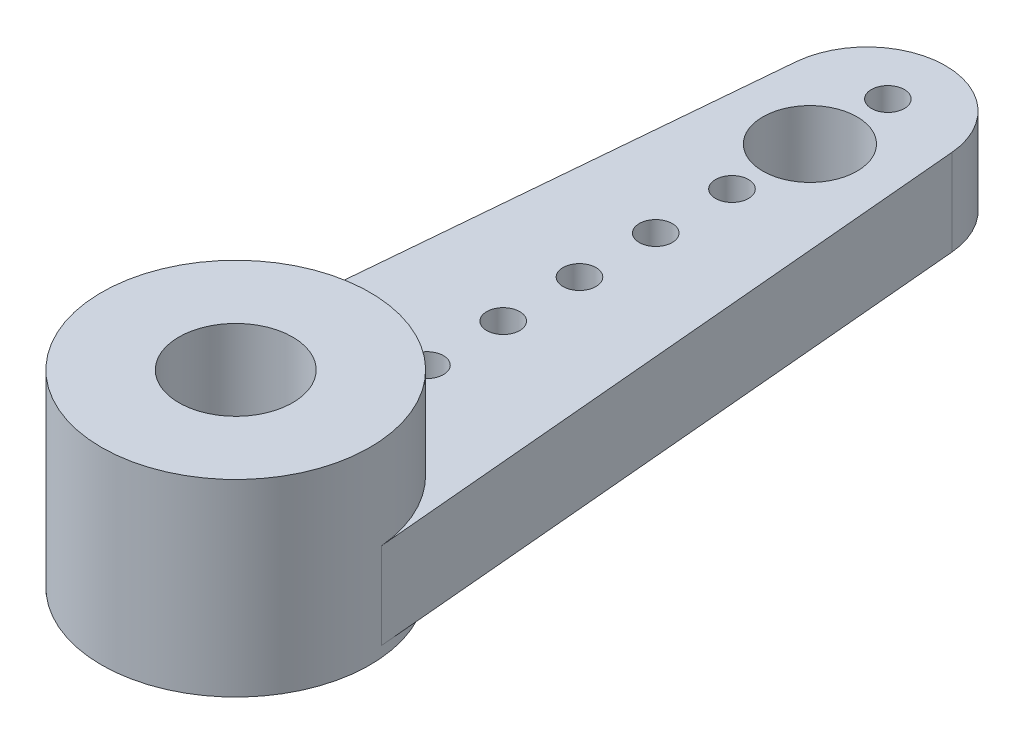
ISO-10303-21;
HEADER;
FILE_DESCRIPTION(('STEP AP214'),'2;1');
FILE_NAME('part.step','',(''),(''),'','','');
FILE_SCHEMA(('AUTOMOTIVE_DESIGN { 1 0 10303 214 1 1 1 1 }'));
ENDSEC;
DATA;
#1=APPLICATION_CONTEXT('core data for automotive mechanical design processes');
#2=APPLICATION_PROTOCOL_DEFINITION('international standard','automotive_design',2000,#1);
#3=PRODUCT_CONTEXT('',#1,'mechanical');
#4=PRODUCT('Part','Part','',(#3));
#5=PRODUCT_RELATED_PRODUCT_CATEGORY('part','',(#4));
#6=PRODUCT_DEFINITION_FORMATION('','',#4);
#7=PRODUCT_DEFINITION_CONTEXT('part definition',#1,'design');
#8=PRODUCT_DEFINITION('design','',#6,#7);
#9=PRODUCT_DEFINITION_SHAPE('','',#8);
#10=(LENGTH_UNIT() NAMED_UNIT(*) SI_UNIT(.MILLI.,.METRE.));
#11=(NAMED_UNIT(*) PLANE_ANGLE_UNIT() SI_UNIT($,.RADIAN.));
#12=(NAMED_UNIT(*) SI_UNIT($,.STERADIAN.) SOLID_ANGLE_UNIT());
#13=UNCERTAINTY_MEASURE_WITH_UNIT(LENGTH_MEASURE(1.E-05),#10,'distance_accuracy_value','');
#14=(GEOMETRIC_REPRESENTATION_CONTEXT(3) GLOBAL_UNCERTAINTY_ASSIGNED_CONTEXT((#13)) GLOBAL_UNIT_ASSIGNED_CONTEXT((#10,
#11,#12)) REPRESENTATION_CONTEXT('',''));
#15=CARTESIAN_POINT('',(0.,0.,0.));
#16=DIRECTION('',(0.,0.,1.));
#17=DIRECTION('',(1.,0.,0.));
#18=AXIS2_PLACEMENT_3D('',#15,#16,#17);
#19=CARTESIAN_POINT('',(0.,0.,0.));
#20=DIRECTION('',(0.,1.,0.));
#21=DIRECTION('',(0.,0.,1.));
#22=AXIS2_PLACEMENT_3D('',#19,#20,#21);
#23=PLANE('',#22);
#24=CARTESIAN_POINT('',(0.,0.,-16.61));
#25=DIRECTION('',(0.,1.,0.));
#26=DIRECTION('',(0.,0.,1.));
#27=AXIS2_PLACEMENT_3D('',#24,#25,#26);
#28=CIRCLE('',#27,0.42);
#29=CARTESIAN_POINT('',(0.,0.,-16.19));
#30=VERTEX_POINT('',#29);
#31=EDGE_CURVE('E239',#30,#30,#28,.T.);
#32=ORIENTED_EDGE('',*,*,#31,.T.);
#33=EDGE_LOOP('',(#32));
#34=FACE_BOUND('',#33,.T.);
#35=CARTESIAN_POINT('',(0.,0.,-12.64));
#36=DIRECTION('',(0.,1.,0.));
#37=DIRECTION('',(0.,0.,1.));
#38=AXIS2_PLACEMENT_3D('',#35,#36,#37);
#39=CIRCLE('',#38,0.419999999999999);
#40=CARTESIAN_POINT('',(0.,0.,-12.22));
#41=VERTEX_POINT('',#40);
#42=EDGE_CURVE('E233',#41,#41,#39,.T.);
#43=ORIENTED_EDGE('',*,*,#42,.T.);
#44=EDGE_LOOP('',(#43));
#45=FACE_BOUND('',#44,.T.);
#46=CARTESIAN_POINT('',(0.,0.,-10.6975));
#47=DIRECTION('',(0.,1.,0.));
#48=DIRECTION('',(0.,0.,1.));
#49=AXIS2_PLACEMENT_3D('',#46,#47,#48);
#50=CIRCLE('',#49,0.419999999999999);
#51=CARTESIAN_POINT('',(0.,0.,-10.2775));
#52=VERTEX_POINT('',#51);
#53=EDGE_CURVE('E227',#52,#52,#50,.T.);
#54=ORIENTED_EDGE('',*,*,#53,.T.);
#55=EDGE_LOOP('',(#54));
#56=FACE_BOUND('',#55,.T.);
#57=CARTESIAN_POINT('',(0.,0.,-8.755));
#58=DIRECTION('',(0.,1.,0.));
#59=DIRECTION('',(0.,0.,1.));
#60=AXIS2_PLACEMENT_3D('',#57,#58,#59);
#61=CIRCLE('',#60,0.419999999999999);
#62=CARTESIAN_POINT('',(0.,0.,-8.335));
#63=VERTEX_POINT('',#62);
#64=EDGE_CURVE('E221',#63,#63,#61,.T.);
#65=ORIENTED_EDGE('',*,*,#64,.T.);
#66=EDGE_LOOP('',(#65));
#67=FACE_BOUND('',#66,.T.);
#68=CARTESIAN_POINT('',(0.,0.,-6.8125));
#69=DIRECTION('',(0.,1.,0.));
#70=DIRECTION('',(0.,0.,1.));
#71=AXIS2_PLACEMENT_3D('',#68,#69,#70);
#72=CIRCLE('',#71,0.42);
#73=CARTESIAN_POINT('',(0.,0.,-6.3925));
#74=VERTEX_POINT('',#73);
#75=EDGE_CURVE('E215',#74,#74,#72,.T.);
#76=ORIENTED_EDGE('',*,*,#75,.T.);
#77=EDGE_LOOP('',(#76));
#78=FACE_BOUND('',#77,.T.);
#79=CARTESIAN_POINT('',(0.,0.,-4.87));
#80=DIRECTION('',(0.,1.,0.));
#81=DIRECTION('',(0.,0.,1.));
#82=AXIS2_PLACEMENT_3D('',#79,#80,#81);
#83=CIRCLE('',#82,0.42);
#84=CARTESIAN_POINT('',(0.,0.,-4.45));
#85=VERTEX_POINT('',#84);
#86=EDGE_CURVE('E209',#85,#85,#83,.T.);
#87=ORIENTED_EDGE('',*,*,#86,.T.);
#88=EDGE_LOOP('',(#87));
#89=FACE_BOUND('',#88,.T.);
#90=CARTESIAN_POINT('',(0.,0.,0.));
#91=DIRECTION('',(0.,-1.,0.));
#92=DIRECTION('',(0.,0.,-1.));
#93=AXIS2_PLACEMENT_3D('',#90,#91,#92);
#94=CIRCLE('',#93,3.42);
#95=CARTESIAN_POINT('',(-3.40663866367595,0.,-0.302014925373134));
#96=VERTEX_POINT('',#95);
#97=CARTESIAN_POINT('',(3.40663866367595,0.,-0.302014925373134));
#98=VERTEX_POINT('',#97);
#99=EDGE_CURVE('E12',#96,#98,#94,.T.);
#100=ORIENTED_EDGE('',*,*,#99,.F.);
#101=DIRECTION('',(-0.0883084577114428,0.,0.996093176513436));
#102=VECTOR('',#101,1.);
#103=CARTESIAN_POINT('',(-3.40663866367595,0.,-0.302014925373134));
#104=LINE('',#103,#102);
#105=CARTESIAN_POINT('',(-1.99218635302687,0.,-16.2566169154229));
#106=VERTEX_POINT('',#105);
#107=EDGE_CURVE('E104',#106,#96,#104,.T.);
#108=ORIENTED_EDGE('',*,*,#107,.F.);
#109=CARTESIAN_POINT('',(0.,0.,-16.08));
#110=DIRECTION('',(0.,1.,0.));
#111=DIRECTION('',(0.,0.,1.));
#112=AXIS2_PLACEMENT_3D('',#109,#110,#111);
#113=CIRCLE('',#112,2.);
#114=CARTESIAN_POINT('',(1.99218635302687,0.,-16.2566169154229));
#115=VERTEX_POINT('',#114);
#116=EDGE_CURVE('E68',#115,#106,#113,.T.);
#117=ORIENTED_EDGE('',*,*,#116,.F.);
#118=DIRECTION('',(-0.0883084577114427,0.,-0.996093176513436));
#119=VECTOR('',#118,1.);
#120=CARTESIAN_POINT('',(1.99218635302687,0.,-16.2566169154229));
#121=LINE('',#120,#119);
#122=EDGE_CURVE('E86',#98,#115,#121,.T.);
#123=ORIENTED_EDGE('',*,*,#122,.F.);
#124=EDGE_LOOP('',(#100,#108,#117,#123));
#125=FACE_BOUND('',#124,.T.);
#126=CARTESIAN_POINT('',(0.,0.,-14.625));
#127=DIRECTION('',(0.,-1.,0.));
#128=DIRECTION('',(0.,0.,-1.));
#129=AXIS2_PLACEMENT_3D('',#126,#127,#128);
#130=CIRCLE('',#129,1.19999999999999);
#131=CARTESIAN_POINT('',(0.,0.,-15.825));
#132=VERTEX_POINT('',#131);
#133=EDGE_CURVE('E189',#132,#132,#130,.T.);
#134=ORIENTED_EDGE('',*,*,#133,.F.);
#135=EDGE_LOOP('',(#134));
#136=FACE_BOUND('',#135,.T.);
#137=ADVANCED_FACE('F35',(#34,#45,#56,#67,#78,#89,#125,#136),#23,.F.);
#138=CARTESIAN_POINT('',(0.,2.2,0.));
#139=DIRECTION('',(0.,-1.,0.));
#140=DIRECTION('',(0.,0.,-1.));
#141=AXIS2_PLACEMENT_3D('',#138,#139,#140);
#142=CYLINDRICAL_SURFACE('',#141,3.42);
#143=DIRECTION('',(0.,-1.,0.));
#144=VECTOR('',#143,1.);
#145=CARTESIAN_POINT('',(-3.40663866367595,2.2,-0.302014925373134));
#146=LINE('',#145,#144);
#147=CARTESIAN_POINT('',(-3.40663866367595,2.2,-0.302014925373134));
#148=VERTEX_POINT('',#147);
#149=EDGE_CURVE('E95',#148,#96,#146,.T.);
#150=ORIENTED_EDGE('',*,*,#149,.T.);
#151=ORIENTED_EDGE('',*,*,#99,.T.);
#152=DIRECTION('',(0.,-1.,0.));
#153=VECTOR('',#152,1.);
#154=CARTESIAN_POINT('',(3.40663866367595,2.2,-0.302014925373136));
#155=LINE('',#154,#153);
#156=CARTESIAN_POINT('',(3.40663866367595,2.2,-0.302014925373136));
#157=VERTEX_POINT('',#156);
#158=EDGE_CURVE('E39',#157,#98,#155,.T.);
#159=ORIENTED_EDGE('',*,*,#158,.F.);
#160=CARTESIAN_POINT('',(0.,2.2,0.));
#161=DIRECTION('',(0.,1.,0.));
#162=DIRECTION('',(0.,0.,1.));
#163=AXIS2_PLACEMENT_3D('',#160,#161,#162);
#164=CIRCLE('',#163,3.42);
#165=EDGE_CURVE('E96',#157,#148,#164,.T.);
#166=ORIENTED_EDGE('',*,*,#165,.T.);
#167=EDGE_LOOP('',(#150,#151,#159,#166));
#168=FACE_BOUND('',#167,.T.);
#169=CARTESIAN_POINT('',(0.,4.53,0.));
#170=DIRECTION('',(0.,1.,0.));
#171=DIRECTION('',(0.,0.,1.));
#172=AXIS2_PLACEMENT_3D('',#169,#170,#171);
#173=CIRCLE('',#172,3.42);
#174=CARTESIAN_POINT('',(0.,4.53,3.42));
#175=VERTEX_POINT('',#174);
#176=EDGE_CURVE('E91',#175,#175,#173,.T.);
#177=ORIENTED_EDGE('',*,*,#176,.F.);
#178=EDGE_LOOP('',(#177));
#179=FACE_BOUND('',#178,.T.);
#180=CARTESIAN_POINT('',(0.,-0.269999999999999,0.));
#181=DIRECTION('',(0.,1.,0.));
#182=DIRECTION('',(0.,0.,1.));
#183=AXIS2_PLACEMENT_3D('',#180,#181,#182);
#184=CIRCLE('',#183,3.42);
#185=CARTESIAN_POINT('',(0.,-0.269999999999999,3.42));
#186=VERTEX_POINT('',#185);
#187=EDGE_CURVE('E203',#186,#186,#184,.T.);
#188=ORIENTED_EDGE('',*,*,#187,.T.);
#189=EDGE_LOOP('',(#188));
#190=FACE_BOUND('',#189,.T.);
#191=ADVANCED_FACE('F37',(#168,#179,#190),#142,.T.);
#192=CARTESIAN_POINT('',(1.99218635302687,2.2,-16.2566169154229));
#193=DIRECTION('',(-0.996093176513436,0.,0.0883084577114427));
#194=DIRECTION('',(0.0883084577114427,0.,0.996093176513436));
#195=AXIS2_PLACEMENT_3D('',#192,#193,#194);
#196=PLANE('',#195);
#197=ORIENTED_EDGE('',*,*,#122,.T.);
#198=DIRECTION('',(0.,-1.,0.));
#199=VECTOR('',#198,1.);
#200=CARTESIAN_POINT('',(1.99218635302687,2.2,-16.2566169154229));
#201=LINE('',#200,#199);
#202=CARTESIAN_POINT('',(1.99218635302687,2.2,-16.2566169154229));
#203=VERTEX_POINT('',#202);
#204=EDGE_CURVE('E89',#203,#115,#201,.T.);
#205=ORIENTED_EDGE('',*,*,#204,.F.);
#206=DIRECTION('',(-0.0883084577114427,0.,-0.996093176513436));
#207=VECTOR('',#206,1.);
#208=CARTESIAN_POINT('',(1.99218635302687,2.2,-16.2566169154229));
#209=LINE('',#208,#207);
#210=EDGE_CURVE('E77',#157,#203,#209,.T.);
#211=ORIENTED_EDGE('',*,*,#210,.F.);
#212=ORIENTED_EDGE('',*,*,#158,.T.);
#213=EDGE_LOOP('',(#197,#205,#211,#212));
#214=FACE_BOUND('',#213,.T.);
#215=ADVANCED_FACE('F85',(#214),#196,.F.);
#216=CARTESIAN_POINT('',(0.,2.2,-16.08));
#217=DIRECTION('',(0.,-1.,0.));
#218=DIRECTION('',(0.,0.,-1.));
#219=AXIS2_PLACEMENT_3D('',#216,#217,#218);
#220=CYLINDRICAL_SURFACE('',#219,2.);
#221=ORIENTED_EDGE('',*,*,#116,.T.);
#222=DIRECTION('',(0.,-1.,0.));
#223=VECTOR('',#222,1.);
#224=CARTESIAN_POINT('',(-1.99218635302687,2.2,-16.2566169154229));
#225=LINE('',#224,#223);
#226=CARTESIAN_POINT('',(-1.99218635302687,2.2,-16.2566169154229));
#227=VERTEX_POINT('',#226);
#228=EDGE_CURVE('E98',#227,#106,#225,.T.);
#229=ORIENTED_EDGE('',*,*,#228,.F.);
#230=CARTESIAN_POINT('',(0.,2.2,-16.08));
#231=DIRECTION('',(0.,1.,0.));
#232=DIRECTION('',(0.,0.,1.));
#233=AXIS2_PLACEMENT_3D('',#230,#231,#232);
#234=CIRCLE('',#233,2.);
#235=EDGE_CURVE('E101',#203,#227,#234,.T.);
#236=ORIENTED_EDGE('',*,*,#235,.F.);
#237=ORIENTED_EDGE('',*,*,#204,.T.);
#238=EDGE_LOOP('',(#221,#229,#236,#237));
#239=FACE_BOUND('',#238,.T.);
#240=ADVANCED_FACE('F107',(#239),#220,.T.);
#241=CARTESIAN_POINT('',(-3.40663866367595,2.2,-0.302014925373134));
#242=DIRECTION('',(0.996093176513436,0.,0.0883084577114428));
#243=DIRECTION('',(0.0883084577114428,0.,-0.996093176513436));
#244=AXIS2_PLACEMENT_3D('',#241,#242,#243);
#245=PLANE('',#244);
#246=ORIENTED_EDGE('',*,*,#107,.T.);
#247=ORIENTED_EDGE('',*,*,#149,.F.);
#248=DIRECTION('',(-0.0883084577114428,0.,0.996093176513436));
#249=VECTOR('',#248,1.);
#250=CARTESIAN_POINT('',(-3.40663866367595,2.2,-0.302014925373134));
#251=LINE('',#250,#249);
#252=EDGE_CURVE('E53',#227,#148,#251,.T.);
#253=ORIENTED_EDGE('',*,*,#252,.F.);
#254=ORIENTED_EDGE('',*,*,#228,.T.);
#255=EDGE_LOOP('',(#246,#247,#253,#254));
#256=FACE_BOUND('',#255,.T.);
#257=ADVANCED_FACE('F111',(#256),#245,.F.);
#258=CARTESIAN_POINT('',(0.,2.2,0.));
#259=DIRECTION('',(0.,1.,0.));
#260=DIRECTION('',(0.,0.,1.));
#261=AXIS2_PLACEMENT_3D('',#258,#259,#260);
#262=PLANE('',#261);
#263=CARTESIAN_POINT('',(0.,2.2,-14.625));
#264=DIRECTION('',(0.,1.,0.));
#265=DIRECTION('',(0.,0.,1.));
#266=AXIS2_PLACEMENT_3D('',#263,#264,#265);
#267=CIRCLE('',#266,1.19999999999999);
#268=CARTESIAN_POINT('',(0.,2.2,-13.425));
#269=VERTEX_POINT('',#268);
#270=EDGE_CURVE('E186',#269,#269,#267,.T.);
#271=ORIENTED_EDGE('',*,*,#270,.F.);
#272=EDGE_LOOP('',(#271));
#273=FACE_BOUND('',#272,.T.);
#274=CARTESIAN_POINT('',(0.,2.2,-4.87));
#275=DIRECTION('',(0.,1.,0.));
#276=DIRECTION('',(0.,0.,1.));
#277=AXIS2_PLACEMENT_3D('',#274,#275,#276);
#278=CIRCLE('',#277,0.42);
#279=CARTESIAN_POINT('',(0.,2.2,-4.45));
#280=VERTEX_POINT('',#279);
#281=EDGE_CURVE('E212',#280,#280,#278,.T.);
#282=ORIENTED_EDGE('',*,*,#281,.F.);
#283=EDGE_LOOP('',(#282));
#284=FACE_BOUND('',#283,.T.);
#285=CARTESIAN_POINT('',(0.,2.2,-6.8125));
#286=DIRECTION('',(0.,1.,0.));
#287=DIRECTION('',(0.,0.,1.));
#288=AXIS2_PLACEMENT_3D('',#285,#286,#287);
#289=CIRCLE('',#288,0.42);
#290=CARTESIAN_POINT('',(0.,2.2,-6.3925));
#291=VERTEX_POINT('',#290);
#292=EDGE_CURVE('E218',#291,#291,#289,.T.);
#293=ORIENTED_EDGE('',*,*,#292,.F.);
#294=EDGE_LOOP('',(#293));
#295=FACE_BOUND('',#294,.T.);
#296=CARTESIAN_POINT('',(0.,2.2,-8.755));
#297=DIRECTION('',(0.,1.,0.));
#298=DIRECTION('',(0.,0.,1.));
#299=AXIS2_PLACEMENT_3D('',#296,#297,#298);
#300=CIRCLE('',#299,0.419999999999999);
#301=CARTESIAN_POINT('',(0.,2.2,-8.335));
#302=VERTEX_POINT('',#301);
#303=EDGE_CURVE('E224',#302,#302,#300,.T.);
#304=ORIENTED_EDGE('',*,*,#303,.F.);
#305=EDGE_LOOP('',(#304));
#306=FACE_BOUND('',#305,.T.);
#307=CARTESIAN_POINT('',(0.,2.2,-10.6975));
#308=DIRECTION('',(0.,1.,0.));
#309=DIRECTION('',(0.,0.,1.));
#310=AXIS2_PLACEMENT_3D('',#307,#308,#309);
#311=CIRCLE('',#310,0.419999999999999);
#312=CARTESIAN_POINT('',(0.,2.2,-10.2775));
#313=VERTEX_POINT('',#312);
#314=EDGE_CURVE('E230',#313,#313,#311,.T.);
#315=ORIENTED_EDGE('',*,*,#314,.F.);
#316=EDGE_LOOP('',(#315));
#317=FACE_BOUND('',#316,.T.);
#318=CARTESIAN_POINT('',(0.,2.2,-12.64));
#319=DIRECTION('',(0.,1.,0.));
#320=DIRECTION('',(0.,0.,1.));
#321=AXIS2_PLACEMENT_3D('',#318,#319,#320);
#322=CIRCLE('',#321,0.419999999999999);
#323=CARTESIAN_POINT('',(0.,2.2,-12.22));
#324=VERTEX_POINT('',#323);
#325=EDGE_CURVE('E236',#324,#324,#322,.T.);
#326=ORIENTED_EDGE('',*,*,#325,.F.);
#327=EDGE_LOOP('',(#326));
#328=FACE_BOUND('',#327,.T.);
#329=CARTESIAN_POINT('',(0.,2.2,-16.61));
#330=DIRECTION('',(0.,1.,0.));
#331=DIRECTION('',(0.,0.,1.));
#332=AXIS2_PLACEMENT_3D('',#329,#330,#331);
#333=CIRCLE('',#332,0.42);
#334=CARTESIAN_POINT('',(0.,2.2,-16.19));
#335=VERTEX_POINT('',#334);
#336=EDGE_CURVE('E208',#335,#335,#333,.T.);
#337=ORIENTED_EDGE('',*,*,#336,.F.);
#338=EDGE_LOOP('',(#337));
#339=FACE_BOUND('',#338,.T.);
#340=ORIENTED_EDGE('',*,*,#165,.F.);
#341=ORIENTED_EDGE('',*,*,#210,.T.);
#342=ORIENTED_EDGE('',*,*,#235,.T.);
#343=ORIENTED_EDGE('',*,*,#252,.T.);
#344=EDGE_LOOP('',(#340,#341,#342,#343));
#345=FACE_BOUND('',#344,.T.);
#346=ADVANCED_FACE('F113',(#273,#284,#295,#306,#317,#328,#339,#345),#262,.T.);
#347=CARTESIAN_POINT('',(0.,4.53,0.));
#348=DIRECTION('',(0.,1.,0.));
#349=DIRECTION('',(0.,0.,1.));
#350=AXIS2_PLACEMENT_3D('',#347,#348,#349);
#351=PLANE('',#350);
#352=CARTESIAN_POINT('',(0.,4.53,0.));
#353=DIRECTION('',(0.,-1.,0.));
#354=DIRECTION('',(0.,0.,-1.));
#355=AXIS2_PLACEMENT_3D('',#352,#353,#354);
#356=CIRCLE('',#355,1.45);
#357=CARTESIAN_POINT('',(0.,4.53,-1.45));
#358=VERTEX_POINT('',#357);
#359=EDGE_CURVE('E196',#358,#358,#356,.T.);
#360=ORIENTED_EDGE('',*,*,#359,.T.);
#361=EDGE_LOOP('',(#360));
#362=FACE_BOUND('',#361,.T.);
#363=ORIENTED_EDGE('',*,*,#176,.T.);
#364=EDGE_LOOP('',(#363));
#365=FACE_BOUND('',#364,.T.);
#366=ADVANCED_FACE('F120',(#362,#365),#351,.T.);
#367=CARTESIAN_POINT('',(0.,0.,-16.61));
#368=DIRECTION('',(0.,1.,0.));
#369=DIRECTION('',(0.,0.,1.));
#370=AXIS2_PLACEMENT_3D('',#367,#368,#369);
#371=CYLINDRICAL_SURFACE('',#370,0.42);
#372=ORIENTED_EDGE('',*,*,#31,.F.);
#373=EDGE_LOOP('',(#372));
#374=FACE_BOUND('',#373,.T.);
#375=ORIENTED_EDGE('',*,*,#336,.T.);
#376=EDGE_LOOP('',(#375));
#377=FACE_BOUND('',#376,.T.);
#378=ADVANCED_FACE('F136',(#374,#377),#371,.F.);
#379=CARTESIAN_POINT('',(0.,0.,-12.64));
#380=DIRECTION('',(0.,1.,0.));
#381=DIRECTION('',(0.,0.,1.));
#382=AXIS2_PLACEMENT_3D('',#379,#380,#381);
#383=CYLINDRICAL_SURFACE('',#382,0.419999999999999);
#384=ORIENTED_EDGE('',*,*,#42,.F.);
#385=EDGE_LOOP('',(#384));
#386=FACE_BOUND('',#385,.T.);
#387=ORIENTED_EDGE('',*,*,#325,.T.);
#388=EDGE_LOOP('',(#387));
#389=FACE_BOUND('',#388,.T.);
#390=ADVANCED_FACE('F140',(#386,#389),#383,.F.);
#391=CARTESIAN_POINT('',(0.,0.,-10.6975));
#392=DIRECTION('',(0.,1.,0.));
#393=DIRECTION('',(0.,0.,1.));
#394=AXIS2_PLACEMENT_3D('',#391,#392,#393);
#395=CYLINDRICAL_SURFACE('',#394,0.419999999999999);
#396=ORIENTED_EDGE('',*,*,#53,.F.);
#397=EDGE_LOOP('',(#396));
#398=FACE_BOUND('',#397,.T.);
#399=ORIENTED_EDGE('',*,*,#314,.T.);
#400=EDGE_LOOP('',(#399));
#401=FACE_BOUND('',#400,.T.);
#402=ADVANCED_FACE('F144',(#398,#401),#395,.F.);
#403=CARTESIAN_POINT('',(0.,0.,-8.755));
#404=DIRECTION('',(0.,1.,0.));
#405=DIRECTION('',(0.,0.,1.));
#406=AXIS2_PLACEMENT_3D('',#403,#404,#405);
#407=CYLINDRICAL_SURFACE('',#406,0.419999999999999);
#408=ORIENTED_EDGE('',*,*,#64,.F.);
#409=EDGE_LOOP('',(#408));
#410=FACE_BOUND('',#409,.T.);
#411=ORIENTED_EDGE('',*,*,#303,.T.);
#412=EDGE_LOOP('',(#411));
#413=FACE_BOUND('',#412,.T.);
#414=ADVANCED_FACE('F148',(#410,#413),#407,.F.);
#415=CARTESIAN_POINT('',(0.,0.,-6.8125));
#416=DIRECTION('',(0.,1.,0.));
#417=DIRECTION('',(0.,0.,1.));
#418=AXIS2_PLACEMENT_3D('',#415,#416,#417);
#419=CYLINDRICAL_SURFACE('',#418,0.42);
#420=ORIENTED_EDGE('',*,*,#75,.F.);
#421=EDGE_LOOP('',(#420));
#422=FACE_BOUND('',#421,.T.);
#423=ORIENTED_EDGE('',*,*,#292,.T.);
#424=EDGE_LOOP('',(#423));
#425=FACE_BOUND('',#424,.T.);
#426=ADVANCED_FACE('F152',(#422,#425),#419,.F.);
#427=CARTESIAN_POINT('',(0.,0.,-4.87));
#428=DIRECTION('',(0.,1.,0.));
#429=DIRECTION('',(0.,0.,1.));
#430=AXIS2_PLACEMENT_3D('',#427,#428,#429);
#431=CYLINDRICAL_SURFACE('',#430,0.42);
#432=ORIENTED_EDGE('',*,*,#86,.F.);
#433=EDGE_LOOP('',(#432));
#434=FACE_BOUND('',#433,.T.);
#435=ORIENTED_EDGE('',*,*,#281,.T.);
#436=EDGE_LOOP('',(#435));
#437=FACE_BOUND('',#436,.T.);
#438=ADVANCED_FACE('F156',(#434,#437),#431,.F.);
#439=CARTESIAN_POINT('',(0.,-0.269999999999999,0.));
#440=DIRECTION('',(0.,1.,0.));
#441=DIRECTION('',(0.,0.,1.));
#442=AXIS2_PLACEMENT_3D('',#439,#440,#441);
#443=PLANE('',#442);
#444=CARTESIAN_POINT('',(0.,-0.269999999999999,0.));
#445=DIRECTION('',(0.,-1.,0.));
#446=DIRECTION('',(0.,0.,-1.));
#447=AXIS2_PLACEMENT_3D('',#444,#445,#446);
#448=CIRCLE('',#447,2.29);
#449=CARTESIAN_POINT('',(0.,-0.269999999999999,-2.29));
#450=VERTEX_POINT('',#449);
#451=EDGE_CURVE('E199',#450,#450,#448,.T.);
#452=ORIENTED_EDGE('',*,*,#451,.F.);
#453=EDGE_LOOP('',(#452));
#454=FACE_BOUND('',#453,.T.);
#455=ORIENTED_EDGE('',*,*,#187,.F.);
#456=EDGE_LOOP('',(#455));
#457=FACE_BOUND('',#456,.T.);
#458=ADVANCED_FACE('F160',(#454,#457),#443,.F.);
#459=CARTESIAN_POINT('',(0.,0.580000000000001,0.));
#460=DIRECTION('',(0.,-1.,0.));
#461=DIRECTION('',(0.,0.,-1.));
#462=AXIS2_PLACEMENT_3D('',#459,#460,#461);
#463=CYLINDRICAL_SURFACE('',#462,2.29);
#464=CARTESIAN_POINT('',(0.,0.580000000000001,0.));
#465=DIRECTION('',(0.,-1.,0.));
#466=DIRECTION('',(0.,0.,-1.));
#467=AXIS2_PLACEMENT_3D('',#464,#465,#466);
#468=CIRCLE('',#467,2.29);
#469=CARTESIAN_POINT('',(0.,0.580000000000001,-2.29));
#470=VERTEX_POINT('',#469);
#471=EDGE_CURVE('E200',#470,#470,#468,.T.);
#472=ORIENTED_EDGE('',*,*,#471,.F.);
#473=EDGE_LOOP('',(#472));
#474=FACE_BOUND('',#473,.T.);
#475=ORIENTED_EDGE('',*,*,#451,.T.);
#476=EDGE_LOOP('',(#475));
#477=FACE_BOUND('',#476,.T.);
#478=ADVANCED_FACE('F164',(#474,#477),#463,.F.);
#479=CARTESIAN_POINT('',(0.,0.580000000000001,0.));
#480=DIRECTION('',(0.,-1.,0.));
#481=DIRECTION('',(0.,0.,-1.));
#482=AXIS2_PLACEMENT_3D('',#479,#480,#481);
#483=PLANE('',#482);
#484=CARTESIAN_POINT('',(0.,0.579999999999999,0.));
#485=DIRECTION('',(0.,-1.,0.));
#486=DIRECTION('',(0.,0.,-1.));
#487=AXIS2_PLACEMENT_3D('',#484,#485,#486);
#488=CIRCLE('',#487,1.44999999999999);
#489=CARTESIAN_POINT('',(0.,0.579999999999999,-1.44999999999999));
#490=VERTEX_POINT('',#489);
#491=EDGE_CURVE('E191',#490,#490,#488,.T.);
#492=ORIENTED_EDGE('',*,*,#491,.F.);
#493=EDGE_LOOP('',(#492));
#494=FACE_BOUND('',#493,.T.);
#495=ORIENTED_EDGE('',*,*,#471,.T.);
#496=EDGE_LOOP('',(#495));
#497=FACE_BOUND('',#496,.T.);
#498=ADVANCED_FACE('F168',(#494,#497),#483,.T.);
#499=CARTESIAN_POINT('',(0.,0.580000000000001,0.));
#500=DIRECTION('',(0.,-1.,0.));
#501=DIRECTION('',(0.,0.,-1.));
#502=AXIS2_PLACEMENT_3D('',#499,#500,#501);
#503=CYLINDRICAL_SURFACE('',#502,1.44999999999999);
#504=ORIENTED_EDGE('',*,*,#359,.F.);
#505=EDGE_LOOP('',(#504));
#506=FACE_BOUND('',#505,.T.);
#507=ORIENTED_EDGE('',*,*,#491,.T.);
#508=EDGE_LOOP('',(#507));
#509=FACE_BOUND('',#508,.T.);
#510=ADVANCED_FACE('F172',(#506,#509),#503,.F.);
#511=CARTESIAN_POINT('',(0.,0.,-14.625));
#512=DIRECTION('',(0.,-1.,0.));
#513=DIRECTION('',(0.,0.,-1.));
#514=AXIS2_PLACEMENT_3D('',#511,#512,#513);
#515=CYLINDRICAL_SURFACE('',#514,1.19999999999999);
#516=ORIENTED_EDGE('',*,*,#270,.T.);
#517=EDGE_LOOP('',(#516));
#518=FACE_BOUND('',#517,.T.);
#519=ORIENTED_EDGE('',*,*,#133,.T.);
#520=EDGE_LOOP('',(#519));
#521=FACE_BOUND('',#520,.T.);
#522=ADVANCED_FACE('F176',(#518,#521),#515,.F.);
#523=CLOSED_SHELL('',(#137,#191,#215,#240,#257,#346,#366,#378,#390,#402,#414,#426,#438,#458,
#478,#498,#510,#522));
#524=MANIFOLD_SOLID_BREP('B2',#523);
#525=ADVANCED_BREP_SHAPE_REPRESENTATION('',(#18,#524),#14);
#526=SHAPE_DEFINITION_REPRESENTATION(#9,#525);
ENDSEC;
END-ISO-10303-21;
